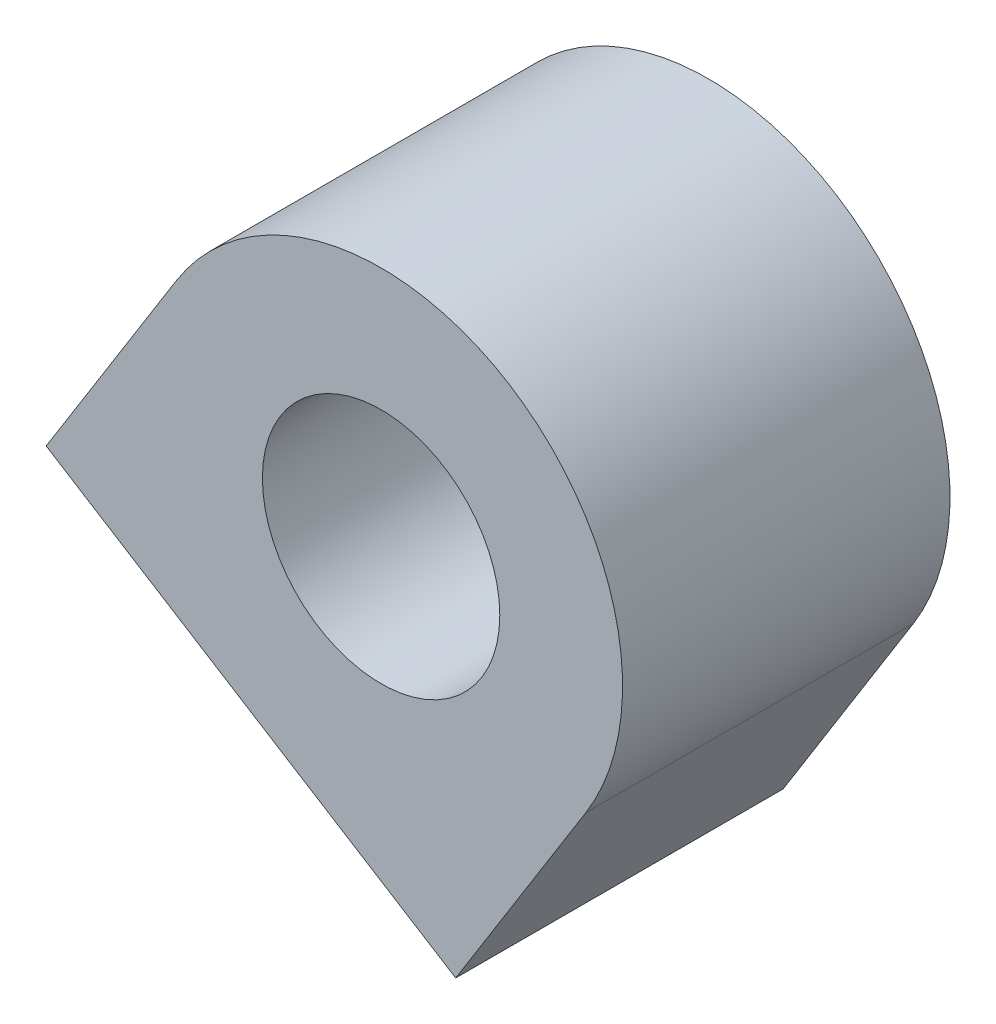
ISO-10303-21;
HEADER;
FILE_DESCRIPTION(('STEP AP214'),'2;1');
FILE_NAME('part.step','',(''),(''),'','','');
FILE_SCHEMA(('AUTOMOTIVE_DESIGN { 1 0 10303 214 1 1 1 1 }'));
ENDSEC;
DATA;
#1=APPLICATION_CONTEXT('core data for automotive mechanical design processes');
#2=APPLICATION_PROTOCOL_DEFINITION('international standard','automotive_design',2000,#1);
#3=PRODUCT_CONTEXT('',#1,'mechanical');
#4=PRODUCT('Part','Part','',(#3));
#5=PRODUCT_RELATED_PRODUCT_CATEGORY('part','',(#4));
#6=PRODUCT_DEFINITION_FORMATION('','',#4);
#7=PRODUCT_DEFINITION_CONTEXT('part definition',#1,'design');
#8=PRODUCT_DEFINITION('design','',#6,#7);
#9=PRODUCT_DEFINITION_SHAPE('','',#8);
#10=(LENGTH_UNIT() NAMED_UNIT(*) SI_UNIT(.MILLI.,.METRE.));
#11=(NAMED_UNIT(*) PLANE_ANGLE_UNIT() SI_UNIT($,.RADIAN.));
#12=(NAMED_UNIT(*) SI_UNIT($,.STERADIAN.) SOLID_ANGLE_UNIT());
#13=UNCERTAINTY_MEASURE_WITH_UNIT(LENGTH_MEASURE(1.E-05),#10,'distance_accuracy_value','');
#14=(GEOMETRIC_REPRESENTATION_CONTEXT(3) GLOBAL_UNCERTAINTY_ASSIGNED_CONTEXT((#13)) GLOBAL_UNIT_ASSIGNED_CONTEXT((#10,
#11,#12)) REPRESENTATION_CONTEXT('',''));
#15=CARTESIAN_POINT('',(0.,0.,0.));
#16=DIRECTION('',(0.,0.,1.));
#17=DIRECTION('',(1.,0.,0.));
#18=AXIS2_PLACEMENT_3D('',#15,#16,#17);
#19=CARTESIAN_POINT('',(0.,0.,5.));
#20=DIRECTION('',(0.,0.,-1.));
#21=DIRECTION('',(-1.,0.,0.));
#22=AXIS2_PLACEMENT_3D('',#19,#20,#21);
#23=PLANE('',#22);
#24=DIRECTION('',(0.847998304005088,-0.52999894000318,0.));
#25=VECTOR('',#24,1.);
#26=CARTESIAN_POINT('',(-23.8775693611304,-38.2041109778086,5.00000000000001));
#27=LINE('',#26,#25);
#28=CARTESIAN_POINT('',(-28.0130754034933,-35.6194197013317,5.));
#29=VERTEX_POINT('',#28);
#30=CARTESIAN_POINT('',(-23.0098854098633,-38.7464134473505,5.));
#31=VERTEX_POINT('',#30);
#32=EDGE_CURVE('E44',#29,#31,#27,.T.);
#33=ORIENTED_EDGE('',*,*,#32,.T.);
#34=DIRECTION('',(0.529998940003177,0.84799830400509,0.));
#35=VECTOR('',#34,1.);
#36=CARTESIAN_POINT('',(0.867683951266957,-0.542302469541844,5.));
#37=LINE('',#36,#35);
#38=CARTESIAN_POINT('',(-21.4198885898538,-36.2024185353352,5.));
#39=VERTEX_POINT('',#38);
#40=EDGE_CURVE('E82',#31,#39,#37,.T.);
#41=ORIENTED_EDGE('',*,*,#40,.T.);
#42=CARTESIAN_POINT('',(-23.9214835866688,-34.6389216623259,5.));
#43=DIRECTION('',(0.,0.,-1.));
#44=DIRECTION('',(-1.,0.,0.));
#45=AXIS2_PLACEMENT_3D('',#42,#43,#44);
#46=CIRCLE('',#45,2.95);
#47=CARTESIAN_POINT('',(-26.4230785834838,-33.0754247893165,5.));
#48=VERTEX_POINT('',#47);
#49=EDGE_CURVE('E88',#39,#48,#46,.F.);
#50=ORIENTED_EDGE('',*,*,#49,.T.);
#51=DIRECTION('',(0.529998940003179,0.847998304005089,0.));
#52=VECTOR('',#51,1.);
#53=CARTESIAN_POINT('',(-4.13550604236299,2.58469127647686,5.));
#54=LINE('',#53,#52);
#55=EDGE_CURVE('E92',#29,#48,#54,.T.);
#56=ORIENTED_EDGE('',*,*,#55,.F.);
#57=EDGE_LOOP('',(#33,#41,#50,#56));
#58=FACE_BOUND('',#57,.T.);
#59=CARTESIAN_POINT('',(-23.9214835866688,-34.6389216623259,5.));
#60=DIRECTION('',(0.,0.,-1.));
#61=DIRECTION('',(-1.,0.,0.));
#62=AXIS2_PLACEMENT_3D('',#59,#60,#61);
#63=CIRCLE('',#62,1.45);
#64=CARTESIAN_POINT('',(-25.3714835866688,-34.6389216623259,5.));
#65=VERTEX_POINT('',#64);
#66=EDGE_CURVE('E87',#65,#65,#63,.F.);
#67=ORIENTED_EDGE('',*,*,#66,.F.);
#68=EDGE_LOOP('',(#67));
#69=FACE_BOUND('',#68,.T.);
#70=ADVANCED_FACE('F41',(#58,#69),#23,.F.);
#71=CARTESIAN_POINT('',(0.867683951266957,-0.542302469541844,17.));
#72=DIRECTION('',(0.84799830400509,-0.529998940003177,0.));
#73=DIRECTION('',(0.529998940003177,0.84799830400509,0.));
#74=AXIS2_PLACEMENT_3D('',#71,#72,#73);
#75=PLANE('',#74);
#76=ORIENTED_EDGE('',*,*,#40,.F.);
#77=DIRECTION('',(0.,0.,-1.));
#78=VECTOR('',#77,1.);
#79=CARTESIAN_POINT('',(-23.0098854098633,-38.7464134473505,17.));
#80=LINE('',#79,#78);
#81=CARTESIAN_POINT('',(-23.0098854098633,-38.7464134473505,1.));
#82=VERTEX_POINT('',#81);
#83=EDGE_CURVE('E64',#31,#82,#80,.T.);
#84=ORIENTED_EDGE('',*,*,#83,.T.);
#85=DIRECTION('',(-0.529998940003177,-0.84799830400509,0.));
#86=VECTOR('',#85,1.);
#87=CARTESIAN_POINT('',(0.867683951266957,-0.542302469541844,1.));
#88=LINE('',#87,#86);
#89=CARTESIAN_POINT('',(-21.4198885898538,-36.2024185353352,1.));
#90=VERTEX_POINT('',#89);
#91=EDGE_CURVE('E110',#90,#82,#88,.T.);
#92=ORIENTED_EDGE('',*,*,#91,.F.);
#93=DIRECTION('',(0.,0.,-1.));
#94=VECTOR('',#93,1.);
#95=CARTESIAN_POINT('',(-21.4198885898538,-36.2024185353352,17.));
#96=LINE('',#95,#94);
#97=EDGE_CURVE('E57',#39,#90,#96,.T.);
#98=ORIENTED_EDGE('',*,*,#97,.F.);
#99=EDGE_LOOP('',(#76,#84,#92,#98));
#100=FACE_BOUND('',#99,.T.);
#101=ADVANCED_FACE('F84',(#100),#75,.T.);
#102=CARTESIAN_POINT('',(0.,0.,1.));
#103=DIRECTION('',(0.,0.,-1.));
#104=DIRECTION('',(-1.,0.,0.));
#105=AXIS2_PLACEMENT_3D('',#102,#103,#104);
#106=PLANE('',#105);
#107=CARTESIAN_POINT('',(-23.9214835866688,-34.6389216623259,1.));
#108=DIRECTION('',(0.,0.,-1.));
#109=DIRECTION('',(-1.,0.,0.));
#110=AXIS2_PLACEMENT_3D('',#107,#108,#109);
#111=CIRCLE('',#110,1.45);
#112=CARTESIAN_POINT('',(-25.3714835866688,-34.6389216623259,1.));
#113=VERTEX_POINT('',#112);
#114=EDGE_CURVE('E11',#113,#113,#111,.T.);
#115=ORIENTED_EDGE('',*,*,#114,.F.);
#116=EDGE_LOOP('',(#115));
#117=FACE_BOUND('',#116,.T.);
#118=CARTESIAN_POINT('',(-23.9214835866688,-34.6389216623259,1.));
#119=DIRECTION('',(0.,0.,-1.));
#120=DIRECTION('',(-1.,0.,0.));
#121=AXIS2_PLACEMENT_3D('',#118,#119,#120);
#122=CIRCLE('',#121,2.95);
#123=CARTESIAN_POINT('',(-26.4230785834838,-33.0754247893165,1.));
#124=VERTEX_POINT('',#123);
#125=EDGE_CURVE('E49',#124,#90,#122,.T.);
#126=ORIENTED_EDGE('',*,*,#125,.T.);
#127=ORIENTED_EDGE('',*,*,#91,.T.);
#128=DIRECTION('',(0.847998304005088,-0.52999894000318,0.));
#129=VECTOR('',#128,1.);
#130=CARTESIAN_POINT('',(-23.8775693611304,-38.2041109778086,1.));
#131=LINE('',#130,#129);
#132=CARTESIAN_POINT('',(-28.0130754034933,-35.6194197013317,1.));
#133=VERTEX_POINT('',#132);
#134=EDGE_CURVE('E98',#133,#82,#131,.T.);
#135=ORIENTED_EDGE('',*,*,#134,.F.);
#136=DIRECTION('',(-0.529998940003179,-0.847998304005088,0.));
#137=VECTOR('',#136,1.);
#138=CARTESIAN_POINT('',(-4.13550604236299,2.58469127647686,1.));
#139=LINE('',#138,#137);
#140=EDGE_CURVE('E101',#124,#133,#139,.T.);
#141=ORIENTED_EDGE('',*,*,#140,.F.);
#142=EDGE_LOOP('',(#126,#127,#135,#141));
#143=FACE_BOUND('',#142,.T.);
#144=ADVANCED_FACE('F129',(#117,#143),#106,.T.);
#145=CARTESIAN_POINT('',(-4.13550604236299,2.58469127647686,17.));
#146=DIRECTION('',(0.847998304005089,-0.529998940003179,0.));
#147=DIRECTION('',(0.529998940003179,0.847998304005089,0.));
#148=AXIS2_PLACEMENT_3D('',#145,#146,#147);
#149=PLANE('',#148);
#150=DIRECTION('',(0.,0.,-1.));
#151=VECTOR('',#150,1.);
#152=CARTESIAN_POINT('',(-28.0130754034933,-35.6194197013317,17.));
#153=LINE('',#152,#151);
#154=EDGE_CURVE('E99',#29,#133,#153,.T.);
#155=ORIENTED_EDGE('',*,*,#154,.F.);
#156=ORIENTED_EDGE('',*,*,#55,.T.);
#157=DIRECTION('',(0.,0.,-1.));
#158=VECTOR('',#157,1.);
#159=CARTESIAN_POINT('',(-26.4230785834838,-33.0754247893165,17.));
#160=LINE('',#159,#158);
#161=EDGE_CURVE('E103',#48,#124,#160,.T.);
#162=ORIENTED_EDGE('',*,*,#161,.T.);
#163=ORIENTED_EDGE('',*,*,#140,.T.);
#164=EDGE_LOOP('',(#155,#156,#162,#163));
#165=FACE_BOUND('',#164,.T.);
#166=ADVANCED_FACE('F118',(#165),#149,.F.);
#167=CARTESIAN_POINT('',(-23.8775693611304,-38.2041109778086,17.));
#168=DIRECTION('',(0.52999894000318,0.847998304005088,0.));
#169=DIRECTION('',(-0.847998304005088,0.52999894000318,0.));
#170=AXIS2_PLACEMENT_3D('',#167,#168,#169);
#171=PLANE('',#170);
#172=ORIENTED_EDGE('',*,*,#32,.F.);
#173=ORIENTED_EDGE('',*,*,#154,.T.);
#174=ORIENTED_EDGE('',*,*,#134,.T.);
#175=ORIENTED_EDGE('',*,*,#83,.F.);
#176=EDGE_LOOP('',(#172,#173,#174,#175));
#177=FACE_BOUND('',#176,.T.);
#178=ADVANCED_FACE('F96',(#177),#171,.F.);
#179=CARTESIAN_POINT('',(-23.9214835866688,-34.6389216623259,17.));
#180=DIRECTION('',(0.,0.,-1.));
#181=DIRECTION('',(-1.,0.,0.));
#182=AXIS2_PLACEMENT_3D('',#179,#180,#181);
#183=CYLINDRICAL_SURFACE('',#182,2.95);
#184=ORIENTED_EDGE('',*,*,#49,.F.);
#185=ORIENTED_EDGE('',*,*,#97,.T.);
#186=ORIENTED_EDGE('',*,*,#125,.F.);
#187=ORIENTED_EDGE('',*,*,#161,.F.);
#188=EDGE_LOOP('',(#184,#185,#186,#187));
#189=FACE_BOUND('',#188,.T.);
#190=ADVANCED_FACE('F115',(#189),#183,.T.);
#191=CARTESIAN_POINT('',(-23.9214835866688,-34.6389216623259,17.));
#192=DIRECTION('',(0.,0.,-1.));
#193=DIRECTION('',(-1.,0.,0.));
#194=AXIS2_PLACEMENT_3D('',#191,#192,#193);
#195=CYLINDRICAL_SURFACE('',#194,1.45);
#196=ORIENTED_EDGE('',*,*,#66,.T.);
#197=EDGE_LOOP('',(#196));
#198=FACE_BOUND('',#197,.T.);
#199=ORIENTED_EDGE('',*,*,#114,.T.);
#200=EDGE_LOOP('',(#199));
#201=FACE_BOUND('',#200,.T.);
#202=ADVANCED_FACE('F123',(#198,#201),#195,.F.);
#203=CLOSED_SHELL('',(#70,#101,#144,#166,#178,#190,#202));
#204=MANIFOLD_SOLID_BREP('B2',#203);
#205=ADVANCED_BREP_SHAPE_REPRESENTATION('',(#18,#204),#14);
#206=SHAPE_DEFINITION_REPRESENTATION(#9,#205);
ENDSEC;
END-ISO-10303-21;
